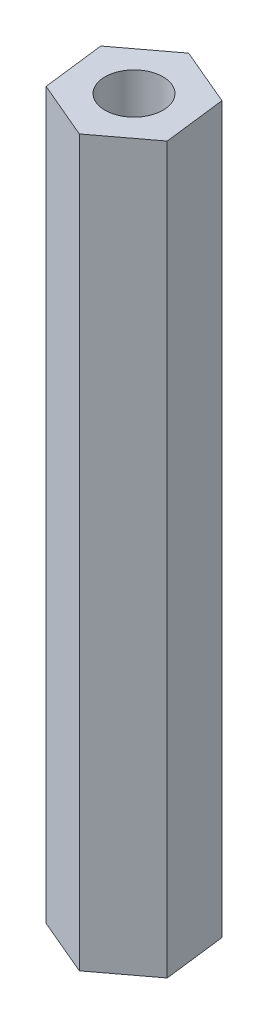
ISO-10303-21;
HEADER;
FILE_DESCRIPTION(('STEP AP214'),'2;1');
FILE_NAME('part.step','',(''),(''),'','','');
FILE_SCHEMA(('AUTOMOTIVE_DESIGN { 1 0 10303 214 1 1 1 1 }'));
ENDSEC;
DATA;
#1=APPLICATION_CONTEXT('core data for automotive mechanical design processes');
#2=APPLICATION_PROTOCOL_DEFINITION('international standard','automotive_design',2000,#1);
#3=PRODUCT_CONTEXT('',#1,'mechanical');
#4=PRODUCT('Part','Part','',(#3));
#5=PRODUCT_RELATED_PRODUCT_CATEGORY('part','',(#4));
#6=PRODUCT_DEFINITION_FORMATION('','',#4);
#7=PRODUCT_DEFINITION_CONTEXT('part definition',#1,'design');
#8=PRODUCT_DEFINITION('design','',#6,#7);
#9=PRODUCT_DEFINITION_SHAPE('','',#8);
#10=(LENGTH_UNIT() NAMED_UNIT(*) SI_UNIT(.MILLI.,.METRE.));
#11=(NAMED_UNIT(*) PLANE_ANGLE_UNIT() SI_UNIT($,.RADIAN.));
#12=(NAMED_UNIT(*) SI_UNIT($,.STERADIAN.) SOLID_ANGLE_UNIT());
#13=UNCERTAINTY_MEASURE_WITH_UNIT(LENGTH_MEASURE(1.E-05),#10,'distance_accuracy_value','');
#14=(GEOMETRIC_REPRESENTATION_CONTEXT(3) GLOBAL_UNCERTAINTY_ASSIGNED_CONTEXT((#13)) GLOBAL_UNIT_ASSIGNED_CONTEXT((#10,
#11,#12)) REPRESENTATION_CONTEXT('',''));
#15=CARTESIAN_POINT('',(0.,0.,0.));
#16=DIRECTION('',(0.,0.,1.));
#17=DIRECTION('',(1.,0.,0.));
#18=AXIS2_PLACEMENT_3D('',#15,#16,#17);
#19=CARTESIAN_POINT('',(0.,40.,0.));
#20=DIRECTION('',(0.,1.,0.));
#21=DIRECTION('',(0.,0.,1.));
#22=AXIS2_PLACEMENT_3D('',#19,#20,#21);
#23=PLANE('',#22);
#24=DIRECTION('',(-0.121573231281397,0.,-0.992582464803706));
#25=VECTOR('',#24,1.);
#26=CARTESIAN_POINT('',(3.18831840783081,40.,1.35448356589777));
#27=LINE('',#26,#25);
#28=CARTESIAN_POINT('',(3.18831840783081,40.,1.35448356589777));
#29=VERTEX_POINT('',#28);
#30=CARTESIAN_POINT('',(2.76717638099141,40.,-2.08392295358615));
#31=VERTEX_POINT('',#30);
#32=EDGE_CURVE('E130',#29,#31,#27,.T.);
#33=ORIENTED_EDGE('',*,*,#32,.T.);
#34=DIRECTION('',(-0.920388245511681,0.,-0.391005725692002));
#35=VECTOR('',#34,1.);
#36=CARTESIAN_POINT('',(2.76717638099141,40.,-2.08392295358615));
#37=LINE('',#36,#35);
#38=CARTESIAN_POINT('',(-0.421142026839402,40.,-3.43840651948392));
#39=VERTEX_POINT('',#38);
#40=EDGE_CURVE('E88',#31,#39,#37,.T.);
#41=ORIENTED_EDGE('',*,*,#40,.T.);
#42=DIRECTION('',(-0.798815014230284,0.,0.601576739111704));
#43=VECTOR('',#42,1.);
#44=CARTESIAN_POINT('',(-0.421142026839402,40.,-3.43840651948392));
#45=LINE('',#44,#43);
#46=CARTESIAN_POINT('',(-3.18831840783081,40.,-1.35448356589777));
#47=VERTEX_POINT('',#46);
#48=EDGE_CURVE('E101',#39,#47,#45,.T.);
#49=ORIENTED_EDGE('',*,*,#48,.T.);
#50=DIRECTION('',(0.121573231281397,0.,0.992582464803706));
#51=VECTOR('',#50,1.);
#52=CARTESIAN_POINT('',(-3.18831840783081,40.,-1.35448356589777));
#53=LINE('',#52,#51);
#54=CARTESIAN_POINT('',(-2.76717638099141,40.,2.08392295358615));
#55=VERTEX_POINT('',#54);
#56=EDGE_CURVE('E95',#47,#55,#53,.T.);
#57=ORIENTED_EDGE('',*,*,#56,.T.);
#58=DIRECTION('',(0.920388245511681,0.,0.391005725692002));
#59=VECTOR('',#58,1.);
#60=CARTESIAN_POINT('',(-2.76717638099141,40.,2.08392295358615));
#61=LINE('',#60,#59);
#62=CARTESIAN_POINT('',(0.421142026839401,40.,3.43840651948392));
#63=VERTEX_POINT('',#62);
#64=EDGE_CURVE('E99',#55,#63,#61,.T.);
#65=ORIENTED_EDGE('',*,*,#64,.T.);
#66=DIRECTION('',(0.798815014230284,0.,-0.601576739111704));
#67=VECTOR('',#66,1.);
#68=CARTESIAN_POINT('',(0.421142026839401,40.,3.43840651948392));
#69=LINE('',#68,#67);
#70=EDGE_CURVE('E51',#63,#29,#69,.T.);
#71=ORIENTED_EDGE('',*,*,#70,.T.);
#72=EDGE_LOOP('',(#33,#41,#49,#57,#65,#71));
#73=FACE_BOUND('',#72,.T.);
#74=CARTESIAN_POINT('',(0.,40.,0.));
#75=DIRECTION('',(0.,1.,0.));
#76=DIRECTION('',(0.,0.,1.));
#77=AXIS2_PLACEMENT_3D('',#74,#75,#76);
#78=CIRCLE('',#77,1.6);
#79=CARTESIAN_POINT('',(0.,40.,1.6));
#80=VERTEX_POINT('',#79);
#81=EDGE_CURVE('E123',#80,#80,#78,.T.);
#82=ORIENTED_EDGE('',*,*,#81,.F.);
#83=EDGE_LOOP('',(#82));
#84=FACE_BOUND('',#83,.T.);
#85=ADVANCED_FACE('F34',(#73,#84),#23,.T.);
#86=CARTESIAN_POINT('',(0.,0.,0.));
#87=DIRECTION('',(0.,1.,0.));
#88=DIRECTION('',(0.,0.,1.));
#89=AXIS2_PLACEMENT_3D('',#86,#87,#88);
#90=PLANE('',#89);
#91=DIRECTION('',(-0.121573231281397,0.,-0.992582464803706));
#92=VECTOR('',#91,1.);
#93=CARTESIAN_POINT('',(3.18831840783081,0.,1.35448356589777));
#94=LINE('',#93,#92);
#95=CARTESIAN_POINT('',(3.18831840783081,0.,1.35448356589777));
#96=VERTEX_POINT('',#95);
#97=CARTESIAN_POINT('',(2.76717638099141,0.,-2.08392295358615));
#98=VERTEX_POINT('',#97);
#99=EDGE_CURVE('E119',#96,#98,#94,.T.);
#100=ORIENTED_EDGE('',*,*,#99,.F.);
#101=DIRECTION('',(0.798815014230284,0.,-0.601576739111704));
#102=VECTOR('',#101,1.);
#103=CARTESIAN_POINT('',(0.421142026839401,0.,3.43840651948392));
#104=LINE('',#103,#102);
#105=CARTESIAN_POINT('',(0.421142026839401,0.,3.43840651948392));
#106=VERTEX_POINT('',#105);
#107=EDGE_CURVE('E80',#106,#96,#104,.T.);
#108=ORIENTED_EDGE('',*,*,#107,.F.);
#109=DIRECTION('',(0.920388245511681,0.,0.391005725692002));
#110=VECTOR('',#109,1.);
#111=CARTESIAN_POINT('',(-2.76717638099141,0.,2.08392295358615));
#112=LINE('',#111,#110);
#113=CARTESIAN_POINT('',(-2.76717638099141,0.,2.08392295358615));
#114=VERTEX_POINT('',#113);
#115=EDGE_CURVE('E74',#114,#106,#112,.T.);
#116=ORIENTED_EDGE('',*,*,#115,.F.);
#117=DIRECTION('',(0.121573231281397,0.,0.992582464803706));
#118=VECTOR('',#117,1.);
#119=CARTESIAN_POINT('',(-3.18831840783081,0.,-1.35448356589777));
#120=LINE('',#119,#118);
#121=CARTESIAN_POINT('',(-3.18831840783081,0.,-1.35448356589777));
#122=VERTEX_POINT('',#121);
#123=EDGE_CURVE('E109',#122,#114,#120,.T.);
#124=ORIENTED_EDGE('',*,*,#123,.F.);
#125=DIRECTION('',(-0.798815014230284,0.,0.601576739111704));
#126=VECTOR('',#125,1.);
#127=CARTESIAN_POINT('',(-0.421142026839402,0.,-3.43840651948392));
#128=LINE('',#127,#126);
#129=CARTESIAN_POINT('',(-0.421142026839402,0.,-3.43840651948392));
#130=VERTEX_POINT('',#129);
#131=EDGE_CURVE('E125',#130,#122,#128,.T.);
#132=ORIENTED_EDGE('',*,*,#131,.F.);
#133=DIRECTION('',(-0.920388245511681,0.,-0.391005725692002));
#134=VECTOR('',#133,1.);
#135=CARTESIAN_POINT('',(2.76717638099141,0.,-2.08392295358615));
#136=LINE('',#135,#134);
#137=EDGE_CURVE('E122',#98,#130,#136,.T.);
#138=ORIENTED_EDGE('',*,*,#137,.F.);
#139=EDGE_LOOP('',(#100,#108,#116,#124,#132,#138));
#140=FACE_BOUND('',#139,.T.);
#141=CARTESIAN_POINT('',(0.,0.,0.));
#142=DIRECTION('',(0.,1.,0.));
#143=DIRECTION('',(0.,0.,1.));
#144=AXIS2_PLACEMENT_3D('',#141,#142,#143);
#145=CIRCLE('',#144,1.6);
#146=CARTESIAN_POINT('',(0.,0.,1.6));
#147=VERTEX_POINT('',#146);
#148=EDGE_CURVE('E223',#147,#147,#145,.T.);
#149=ORIENTED_EDGE('',*,*,#148,.T.);
#150=EDGE_LOOP('',(#149));
#151=FACE_BOUND('',#150,.T.);
#152=ADVANCED_FACE('F139',(#140,#151),#90,.F.);
#153=CARTESIAN_POINT('',(3.18831840783081,40.,1.35448356589777));
#154=DIRECTION('',(-0.992582464803706,0.,0.121573231281397));
#155=DIRECTION('',(0.121573231281397,0.,0.992582464803706));
#156=AXIS2_PLACEMENT_3D('',#153,#154,#155);
#157=PLANE('',#156);
#158=ORIENTED_EDGE('',*,*,#99,.T.);
#159=DIRECTION('',(0.,-1.,0.));
#160=VECTOR('',#159,1.);
#161=CARTESIAN_POINT('',(2.76717638099141,40.,-2.08392295358615));
#162=LINE('',#161,#160);
#163=EDGE_CURVE('E11',#31,#98,#162,.T.);
#164=ORIENTED_EDGE('',*,*,#163,.F.);
#165=ORIENTED_EDGE('',*,*,#32,.F.);
#166=DIRECTION('',(0.,-1.,0.));
#167=VECTOR('',#166,1.);
#168=CARTESIAN_POINT('',(3.18831840783081,40.,1.35448356589777));
#169=LINE('',#168,#167);
#170=EDGE_CURVE('E115',#29,#96,#169,.T.);
#171=ORIENTED_EDGE('',*,*,#170,.T.);
#172=EDGE_LOOP('',(#158,#164,#165,#171));
#173=FACE_BOUND('',#172,.T.);
#174=ADVANCED_FACE('F36',(#173),#157,.F.);
#175=CARTESIAN_POINT('',(2.76717638099141,40.,-2.08392295358615));
#176=DIRECTION('',(-0.391005725692002,0.,0.920388245511681));
#177=DIRECTION('',(0.920388245511681,0.,0.391005725692002));
#178=AXIS2_PLACEMENT_3D('',#175,#176,#177);
#179=PLANE('',#178);
#180=ORIENTED_EDGE('',*,*,#137,.T.);
#181=DIRECTION('',(0.,-1.,0.));
#182=VECTOR('',#181,1.);
#183=CARTESIAN_POINT('',(-0.421142026839402,40.,-3.43840651948392));
#184=LINE('',#183,#182);
#185=EDGE_CURVE('E43',#39,#130,#184,.T.);
#186=ORIENTED_EDGE('',*,*,#185,.F.);
#187=ORIENTED_EDGE('',*,*,#40,.F.);
#188=ORIENTED_EDGE('',*,*,#163,.T.);
#189=EDGE_LOOP('',(#180,#186,#187,#188));
#190=FACE_BOUND('',#189,.T.);
#191=ADVANCED_FACE('F164',(#190),#179,.F.);
#192=CARTESIAN_POINT('',(-0.421142026839402,40.,-3.43840651948392));
#193=DIRECTION('',(0.601576739111704,0.,0.798815014230284));
#194=DIRECTION('',(0.798815014230284,0.,-0.601576739111704));
#195=AXIS2_PLACEMENT_3D('',#192,#193,#194);
#196=PLANE('',#195);
#197=ORIENTED_EDGE('',*,*,#131,.T.);
#198=DIRECTION('',(0.,-1.,0.));
#199=VECTOR('',#198,1.);
#200=CARTESIAN_POINT('',(-3.18831840783081,40.,-1.35448356589777));
#201=LINE('',#200,#199);
#202=EDGE_CURVE('E110',#47,#122,#201,.T.);
#203=ORIENTED_EDGE('',*,*,#202,.F.);
#204=ORIENTED_EDGE('',*,*,#48,.F.);
#205=ORIENTED_EDGE('',*,*,#185,.T.);
#206=EDGE_LOOP('',(#197,#203,#204,#205));
#207=FACE_BOUND('',#206,.T.);
#208=ADVANCED_FACE('F136',(#207),#196,.F.);
#209=CARTESIAN_POINT('',(-3.18831840783081,40.,-1.35448356589777));
#210=DIRECTION('',(0.992582464803706,0.,-0.121573231281397));
#211=DIRECTION('',(-0.121573231281397,0.,-0.992582464803706));
#212=AXIS2_PLACEMENT_3D('',#209,#210,#211);
#213=PLANE('',#212);
#214=ORIENTED_EDGE('',*,*,#123,.T.);
#215=DIRECTION('',(0.,-1.,0.));
#216=VECTOR('',#215,1.);
#217=CARTESIAN_POINT('',(-2.76717638099141,40.,2.08392295358615));
#218=LINE('',#217,#216);
#219=EDGE_CURVE('E106',#55,#114,#218,.T.);
#220=ORIENTED_EDGE('',*,*,#219,.F.);
#221=ORIENTED_EDGE('',*,*,#56,.F.);
#222=ORIENTED_EDGE('',*,*,#202,.T.);
#223=EDGE_LOOP('',(#214,#220,#221,#222));
#224=FACE_BOUND('',#223,.T.);
#225=ADVANCED_FACE('F107',(#224),#213,.F.);
#226=CARTESIAN_POINT('',(-2.76717638099141,40.,2.08392295358615));
#227=DIRECTION('',(0.391005725692002,0.,-0.920388245511681));
#228=DIRECTION('',(-0.920388245511681,0.,-0.391005725692002));
#229=AXIS2_PLACEMENT_3D('',#226,#227,#228);
#230=PLANE('',#229);
#231=ORIENTED_EDGE('',*,*,#115,.T.);
#232=DIRECTION('',(0.,-1.,0.));
#233=VECTOR('',#232,1.);
#234=CARTESIAN_POINT('',(0.421142026839401,40.,3.43840651948392));
#235=LINE('',#234,#233);
#236=EDGE_CURVE('E111',#63,#106,#235,.T.);
#237=ORIENTED_EDGE('',*,*,#236,.F.);
#238=ORIENTED_EDGE('',*,*,#64,.F.);
#239=ORIENTED_EDGE('',*,*,#219,.T.);
#240=EDGE_LOOP('',(#231,#237,#238,#239));
#241=FACE_BOUND('',#240,.T.);
#242=ADVANCED_FACE('F113',(#241),#230,.F.);
#243=CARTESIAN_POINT('',(0.421142026839401,40.,3.43840651948392));
#244=DIRECTION('',(-0.601576739111704,0.,-0.798815014230284));
#245=DIRECTION('',(-0.798815014230284,0.,0.601576739111704));
#246=AXIS2_PLACEMENT_3D('',#243,#244,#245);
#247=PLANE('',#246);
#248=ORIENTED_EDGE('',*,*,#107,.T.);
#249=ORIENTED_EDGE('',*,*,#170,.F.);
#250=ORIENTED_EDGE('',*,*,#70,.F.);
#251=ORIENTED_EDGE('',*,*,#236,.T.);
#252=EDGE_LOOP('',(#248,#249,#250,#251));
#253=FACE_BOUND('',#252,.T.);
#254=ADVANCED_FACE('F144',(#253),#247,.F.);
#255=CARTESIAN_POINT('',(0.,40.,0.));
#256=DIRECTION('',(0.,-1.,0.));
#257=DIRECTION('',(0.,0.,-1.));
#258=AXIS2_PLACEMENT_3D('',#255,#256,#257);
#259=CYLINDRICAL_SURFACE('',#258,1.6);
#260=ORIENTED_EDGE('',*,*,#81,.T.);
#261=EDGE_LOOP('',(#260));
#262=FACE_BOUND('',#261,.T.);
#263=ORIENTED_EDGE('',*,*,#148,.F.);
#264=EDGE_LOOP('',(#263));
#265=FACE_BOUND('',#264,.T.);
#266=ADVANCED_FACE('F146',(#262,#265),#259,.F.);
#267=CLOSED_SHELL('',(#85,#152,#174,#191,#208,#225,#242,#254,#266));
#268=MANIFOLD_SOLID_BREP('B2',#267);
#269=ADVANCED_BREP_SHAPE_REPRESENTATION('',(#18,#268),#14);
#270=SHAPE_DEFINITION_REPRESENTATION(#9,#269);
ENDSEC;
END-ISO-10303-21;
